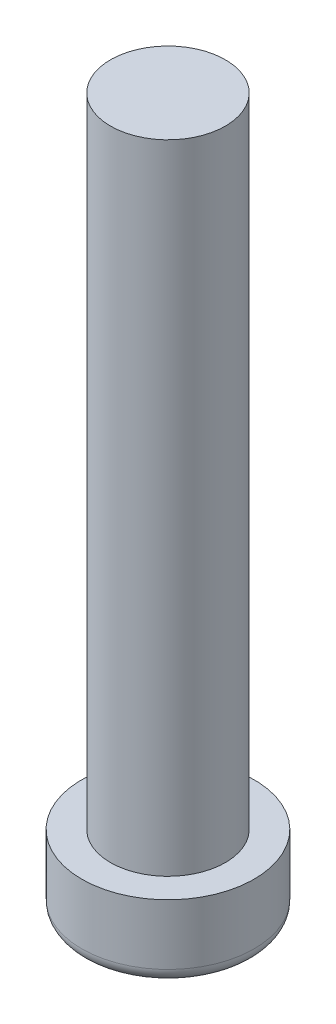
ISO-10303-21;
HEADER;
FILE_DESCRIPTION(('STEP AP214'),'2;1');
FILE_NAME('part.step','',(''),(''),'','','');
FILE_SCHEMA(('AUTOMOTIVE_DESIGN { 1 0 10303 214 1 1 1 1 }'));
ENDSEC;
DATA;
#1=APPLICATION_CONTEXT('core data for automotive mechanical design processes');
#2=APPLICATION_PROTOCOL_DEFINITION('international standard','automotive_design',2000,#1);
#3=PRODUCT_CONTEXT('',#1,'mechanical');
#4=PRODUCT('Part','Part','',(#3));
#5=PRODUCT_RELATED_PRODUCT_CATEGORY('part','',(#4));
#6=PRODUCT_DEFINITION_FORMATION('','',#4);
#7=PRODUCT_DEFINITION_CONTEXT('part definition',#1,'design');
#8=PRODUCT_DEFINITION('design','',#6,#7);
#9=PRODUCT_DEFINITION_SHAPE('','',#8);
#10=(LENGTH_UNIT() NAMED_UNIT(*) SI_UNIT(.MILLI.,.METRE.));
#11=(NAMED_UNIT(*) PLANE_ANGLE_UNIT() SI_UNIT($,.RADIAN.));
#12=(NAMED_UNIT(*) SI_UNIT($,.STERADIAN.) SOLID_ANGLE_UNIT());
#13=UNCERTAINTY_MEASURE_WITH_UNIT(LENGTH_MEASURE(1.E-05),#10,'distance_accuracy_value','');
#14=(GEOMETRIC_REPRESENTATION_CONTEXT(3) GLOBAL_UNCERTAINTY_ASSIGNED_CONTEXT((#13)) GLOBAL_UNIT_ASSIGNED_CONTEXT((#10,
#11,#12)) REPRESENTATION_CONTEXT('',''));
#15=CARTESIAN_POINT('',(0.,0.,0.));
#16=DIRECTION('',(0.,0.,1.));
#17=DIRECTION('',(1.,0.,0.));
#18=AXIS2_PLACEMENT_3D('',#15,#16,#17);
#19=CARTESIAN_POINT('',(0.,2.6,0.));
#20=DIRECTION('',(0.,-1.,0.));
#21=DIRECTION('',(0.,0.,-1.));
#22=AXIS2_PLACEMENT_3D('',#19,#20,#21);
#23=CYLINDRICAL_SURFACE('',#22,3.);
#24=CARTESIAN_POINT('',(0.,0.5,0.));
#25=DIRECTION('',(0.,1.,0.));
#26=DIRECTION('',(0.,0.,1.));
#27=AXIS2_PLACEMENT_3D('',#24,#25,#26);
#28=CIRCLE('',#27,3.);
#29=CARTESIAN_POINT('',(0.,0.5,3.));
#30=VERTEX_POINT('',#29);
#31=EDGE_CURVE('E49',#30,#30,#28,.T.);
#32=ORIENTED_EDGE('',*,*,#31,.T.);
#33=EDGE_LOOP('',(#32));
#34=FACE_BOUND('',#33,.T.);
#35=CARTESIAN_POINT('',(0.,2.6,0.));
#36=DIRECTION('',(0.,1.,0.));
#37=DIRECTION('',(0.,0.,1.));
#38=AXIS2_PLACEMENT_3D('',#35,#36,#37);
#39=CIRCLE('',#38,3.);
#40=CARTESIAN_POINT('',(0.,2.6,3.));
#41=VERTEX_POINT('',#40);
#42=EDGE_CURVE('E59',#41,#41,#39,.T.);
#43=ORIENTED_EDGE('',*,*,#42,.F.);
#44=EDGE_LOOP('',(#43));
#45=FACE_BOUND('',#44,.T.);
#46=ADVANCED_FACE('F41',(#34,#45),#23,.T.);
#47=CARTESIAN_POINT('',(0.,2.6,0.));
#48=DIRECTION('',(0.,1.,0.));
#49=DIRECTION('',(0.,0.,1.));
#50=AXIS2_PLACEMENT_3D('',#47,#48,#49);
#51=PLANE('',#50);
#52=CARTESIAN_POINT('',(0.,2.6,0.));
#53=DIRECTION('',(0.,1.,0.));
#54=DIRECTION('',(0.,0.,1.));
#55=AXIS2_PLACEMENT_3D('',#52,#53,#54);
#56=CIRCLE('',#55,2.);
#57=CARTESIAN_POINT('',(0.,2.6,2.));
#58=VERTEX_POINT('',#57);
#59=EDGE_CURVE('E54',#58,#58,#56,.T.);
#60=ORIENTED_EDGE('',*,*,#59,.F.);
#61=EDGE_LOOP('',(#60));
#62=FACE_BOUND('',#61,.T.);
#63=ORIENTED_EDGE('',*,*,#42,.T.);
#64=EDGE_LOOP('',(#63));
#65=FACE_BOUND('',#64,.T.);
#66=ADVANCED_FACE('F79',(#62,#65),#51,.T.);
#67=CARTESIAN_POINT('',(0.,0.,0.));
#68=DIRECTION('',(0.,1.,0.));
#69=DIRECTION('',(0.,0.,1.));
#70=AXIS2_PLACEMENT_3D('',#67,#68,#69);
#71=PLANE('',#70);
#72=CARTESIAN_POINT('',(0.,0.,0.));
#73=DIRECTION('',(0.,1.,0.));
#74=DIRECTION('',(0.,0.,1.));
#75=AXIS2_PLACEMENT_3D('',#72,#73,#74);
#76=CIRCLE('',#75,2.5);
#77=CARTESIAN_POINT('',(0.,0.,2.5));
#78=VERTEX_POINT('',#77);
#79=EDGE_CURVE('E10',#78,#78,#76,.F.);
#80=ORIENTED_EDGE('',*,*,#79,.T.);
#81=EDGE_LOOP('',(#80));
#82=FACE_BOUND('',#81,.T.);
#83=ADVANCED_FACE('F75',(#82),#71,.F.);
#84=CARTESIAN_POINT('',(0.,24.8,0.));
#85=DIRECTION('',(0.,-1.,0.));
#86=DIRECTION('',(0.,0.,-1.));
#87=AXIS2_PLACEMENT_3D('',#84,#85,#86);
#88=CYLINDRICAL_SURFACE('',#87,2.);
#89=CARTESIAN_POINT('',(0.,24.8,0.));
#90=DIRECTION('',(0.,1.,0.));
#91=DIRECTION('',(0.,0.,1.));
#92=AXIS2_PLACEMENT_3D('',#89,#90,#91);
#93=CIRCLE('',#92,2.);
#94=CARTESIAN_POINT('',(0.,24.8,2.));
#95=VERTEX_POINT('',#94);
#96=EDGE_CURVE('E64',#95,#95,#93,.T.);
#97=ORIENTED_EDGE('',*,*,#96,.F.);
#98=EDGE_LOOP('',(#97));
#99=FACE_BOUND('',#98,.T.);
#100=ORIENTED_EDGE('',*,*,#59,.T.);
#101=EDGE_LOOP('',(#100));
#102=FACE_BOUND('',#101,.T.);
#103=ADVANCED_FACE('F72',(#99,#102),#88,.T.);
#104=CARTESIAN_POINT('',(0.,24.8,0.));
#105=DIRECTION('',(0.,1.,0.));
#106=DIRECTION('',(0.,0.,1.));
#107=AXIS2_PLACEMENT_3D('',#104,#105,#106);
#108=PLANE('',#107);
#109=ORIENTED_EDGE('',*,*,#96,.T.);
#110=EDGE_LOOP('',(#109));
#111=FACE_BOUND('',#110,.T.);
#112=ADVANCED_FACE('F70',(#111),#108,.T.);
#113=CARTESIAN_POINT('',(0.,0.5,0.));
#114=DIRECTION('',(0.,1.,0.));
#115=DIRECTION('',(0.,0.,1.));
#116=AXIS2_PLACEMENT_3D('',#113,#114,#115);
#117=TOROIDAL_SURFACE('',#116,2.5,0.5);
#118=ORIENTED_EDGE('',*,*,#79,.F.);
#119=EDGE_LOOP('',(#118));
#120=FACE_BOUND('',#119,.T.);
#121=ORIENTED_EDGE('',*,*,#31,.F.);
#122=EDGE_LOOP('',(#121));
#123=FACE_BOUND('',#122,.T.);
#124=ADVANCED_FACE('F43',(#120,#123),#117,.T.);
#125=CLOSED_SHELL('',(#46,#66,#83,#103,#112,#124));
#126=MANIFOLD_SOLID_BREP('B2',#125);
#127=ADVANCED_BREP_SHAPE_REPRESENTATION('',(#18,#126),#14);
#128=SHAPE_DEFINITION_REPRESENTATION(#9,#127);
ENDSEC;
END-ISO-10303-21;
